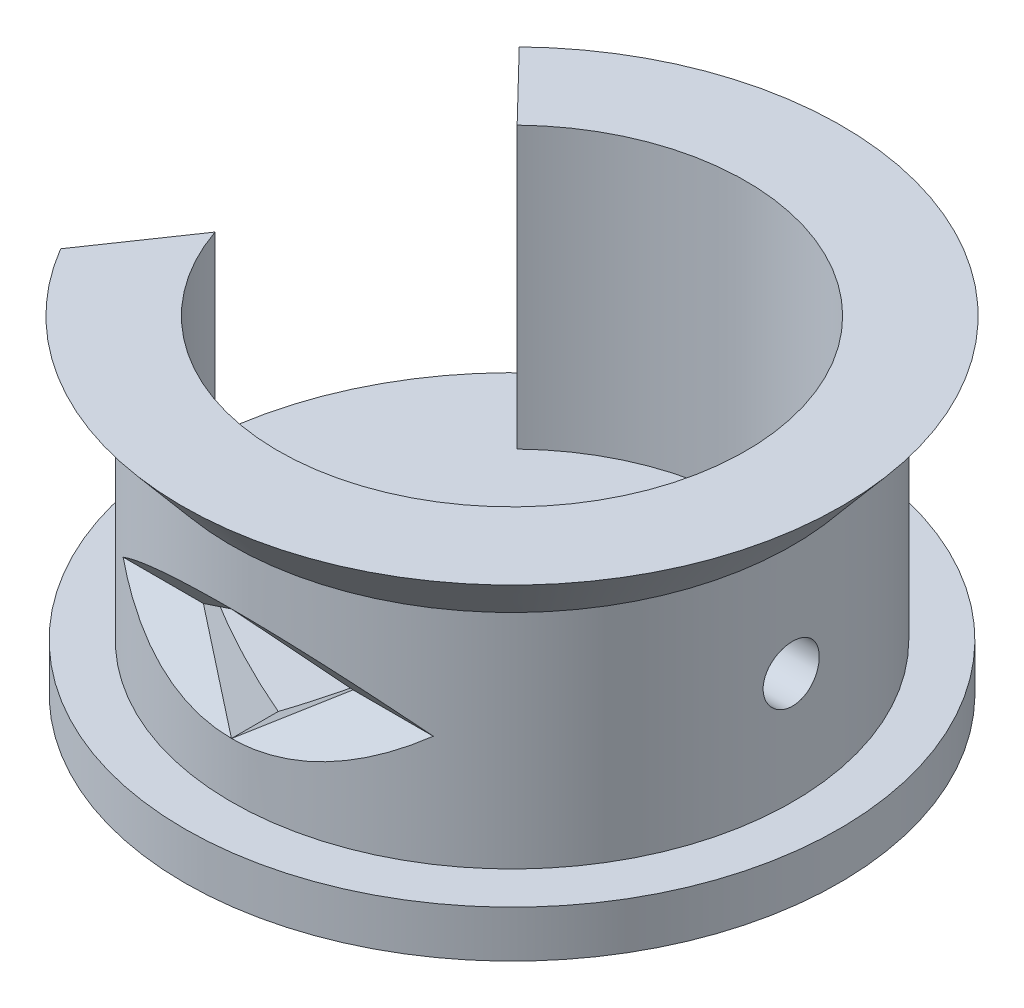
ISO-10303-21;
HEADER;
FILE_DESCRIPTION(('STEP AP214'),'2;1');
FILE_NAME('part.step','',(''),(''),'','','');
FILE_SCHEMA(('AUTOMOTIVE_DESIGN { 1 0 10303 214 1 1 1 1 }'));
ENDSEC;
DATA;
#1=APPLICATION_CONTEXT('core data for automotive mechanical design processes');
#2=APPLICATION_PROTOCOL_DEFINITION('international standard','automotive_design',2000,#1);
#3=PRODUCT_CONTEXT('',#1,'mechanical');
#4=PRODUCT('Part','Part','',(#3));
#5=PRODUCT_RELATED_PRODUCT_CATEGORY('part','',(#4));
#6=PRODUCT_DEFINITION_FORMATION('','',#4);
#7=PRODUCT_DEFINITION_CONTEXT('part definition',#1,'design');
#8=PRODUCT_DEFINITION('design','',#6,#7);
#9=PRODUCT_DEFINITION_SHAPE('','',#8);
#10=(LENGTH_UNIT() NAMED_UNIT(*) SI_UNIT(.MILLI.,.METRE.));
#11=(NAMED_UNIT(*) PLANE_ANGLE_UNIT() SI_UNIT($,.RADIAN.));
#12=(NAMED_UNIT(*) SI_UNIT($,.STERADIAN.) SOLID_ANGLE_UNIT());
#13=UNCERTAINTY_MEASURE_WITH_UNIT(LENGTH_MEASURE(1.E-05),#10,'distance_accuracy_value','');
#14=(GEOMETRIC_REPRESENTATION_CONTEXT(3) GLOBAL_UNCERTAINTY_ASSIGNED_CONTEXT((#13)) GLOBAL_UNIT_ASSIGNED_CONTEXT((#10,
#11,#12)) REPRESENTATION_CONTEXT('',''));
#15=CARTESIAN_POINT('',(0.,0.,0.));
#16=DIRECTION('',(0.,0.,1.));
#17=DIRECTION('',(1.,0.,0.));
#18=AXIS2_PLACEMENT_3D('',#15,#16,#17);
#19=CARTESIAN_POINT('',(0.,5.75,0.));
#20=DIRECTION('',(0.,-1.,0.));
#21=DIRECTION('',(0.,0.,-1.));
#22=AXIS2_PLACEMENT_3D('',#19,#20,#21);
#23=CYLINDRICAL_SURFACE('',#22,6.);
#24=CARTESIAN_POINT('',(0.,9.37500000000016,0.));
#25=DIRECTION('',(0.,-0.64018439966447,-0.768221279597384));
#26=DIRECTION('',(0.,-0.768221279597384,0.64018439966447));
#27=AXIS2_PLACEMENT_3D('',#24,#25,#26);
#28=ELLIPSE('',#27,9.37229961108813,6.);
#29=CARTESIAN_POINT('',(3.3166247903554,3.375,5.));
#30=VERTEX_POINT('',#29);
#31=CARTESIAN_POINT('',(0.,2.17499999999997,6.));
#32=VERTEX_POINT('',#31);
#33=EDGE_CURVE('E162',#30,#32,#28,.T.);
#34=ORIENTED_EDGE('',*,*,#33,.T.);
#35=CARTESIAN_POINT('',(-3.3166247903554,3.375,5.));
#36=VERTEX_POINT('',#35);
#37=EDGE_CURVE('E61',#32,#36,#28,.T.);
#38=ORIENTED_EDGE('',*,*,#37,.T.);
#39=CARTESIAN_POINT('',(0.,-2.625,0.));
#40=DIRECTION('',(0.,0.64018439966448,-0.768221279597376));
#41=DIRECTION('',(0.,-0.768221279597376,-0.64018439966448));
#42=AXIS2_PLACEMENT_3D('',#39,#40,#41);
#43=ELLIPSE('',#42,9.37229961108799,6.);
#44=CARTESIAN_POINT('',(0.,4.575,6.));
#45=VERTEX_POINT('',#44);
#46=EDGE_CURVE('E131',#36,#45,#43,.T.);
#47=ORIENTED_EDGE('',*,*,#46,.T.);
#48=EDGE_CURVE('E122',#45,#30,#43,.T.);
#49=ORIENTED_EDGE('',*,*,#48,.T.);
#50=EDGE_LOOP('',(#34,#38,#47,#49));
#51=FACE_BOUND('',#50,.T.);
#52=DIRECTION('',(0.,-1.,0.));
#53=VECTOR('',#52,1.);
#54=CARTESIAN_POINT('',(-5.40419060518485,5.75,2.60666912032038));
#55=LINE('',#54,#53);
#56=CARTESIAN_POINT('',(-5.40419060518485,1.,2.60666912032038));
#57=VERTEX_POINT('',#56);
#58=CARTESIAN_POINT('',(-5.40419060518485,5.75,2.60666912032038));
#59=VERTEX_POINT('',#58);
#60=EDGE_CURVE('E420',#57,#59,#55,.F.);
#61=ORIENTED_EDGE('',*,*,#60,.F.);
#62=CARTESIAN_POINT('',(0.,1.,0.));
#63=DIRECTION('',(0.,1.,0.));
#64=DIRECTION('',(0.,0.,1.));
#65=AXIS2_PLACEMENT_3D('',#62,#63,#64);
#66=CIRCLE('',#65,6.);
#67=CARTESIAN_POINT('',(-4.17641886951736,1.,-4.30784463813858));
#68=VERTEX_POINT('',#67);
#69=EDGE_CURVE('E387',#57,#68,#66,.T.);
#70=ORIENTED_EDGE('',*,*,#69,.T.);
#71=DIRECTION('',(0.,-1.,0.));
#72=VECTOR('',#71,1.);
#73=CARTESIAN_POINT('',(-4.17641886951736,5.75,-4.30784463813858));
#74=LINE('',#73,#72);
#75=CARTESIAN_POINT('',(-4.17641886951736,5.75,-4.30784463813858));
#76=VERTEX_POINT('',#75);
#77=EDGE_CURVE('E461',#68,#76,#74,.F.);
#78=ORIENTED_EDGE('',*,*,#77,.T.);
#79=CARTESIAN_POINT('',(0.,5.75,0.));
#80=DIRECTION('',(0.,1.,0.));
#81=DIRECTION('',(0.,0.,1.));
#82=AXIS2_PLACEMENT_3D('',#79,#80,#81);
#83=CIRCLE('',#82,6.);
#84=EDGE_CURVE('E400',#59,#76,#83,.T.);
#85=ORIENTED_EDGE('',*,*,#84,.F.);
#86=EDGE_LOOP('',(#61,#70,#78,#85));
#87=FACE_BOUND('',#86,.T.);
#88=CARTESIAN_POINT('',(5.96992462263972,3.375,0.6));
#89=CARTESIAN_POINT('',(5.96992501678142,3.34138826149584,0.599998544036107));
#90=CARTESIAN_POINT('',(5.97021154196531,3.3077542989529,0.597166115389485));
#91=CARTESIAN_POINT('',(5.97132652534872,3.24141888822388,0.585909788858137));
#92=CARTESIAN_POINT('',(5.97215558076732,3.20871850917751,0.577479728931861));
#93=CARTESIAN_POINT('',(5.97426079828433,3.14522050846926,0.555276069641356));
#94=CARTESIAN_POINT('',(5.97553668928074,3.11442174636514,0.541505709776339));
#95=CARTESIAN_POINT('',(5.97839148343092,3.05557932462495,0.50901856043466));
#96=CARTESIAN_POINT('',(5.97997032638597,3.02753511930977,0.490302753375555));
#97=CARTESIAN_POINT('',(5.98325956025939,2.9748892418055,0.448382857199222));
#98=CARTESIAN_POINT('',(5.9849703600316,2.95029899429773,0.425164450864955));
#99=CARTESIAN_POINT('',(5.98832703141431,2.90535743459786,0.374929029191738));
#100=CARTESIAN_POINT('',(5.98997290005128,2.88500631635621,0.347911840143941));
#101=CARTESIAN_POINT('',(5.99301829893363,2.84908124579571,0.290775816990592));
#102=CARTESIAN_POINT('',(5.99441730536788,2.8335174007238,0.260650597517741));
#103=CARTESIAN_POINT('',(5.99680690125462,2.80767334011079,0.198197990572506));
#104=CARTESIAN_POINT('',(5.99779750066238,2.79739299577832,0.165870656800931));
#105=CARTESIAN_POINT('',(5.99925579942616,2.78244125438805,0.100046869645769));
#106=CARTESIAN_POINT('',(5.9997252470569,2.77775110035003,0.0665547162189482));
#107=CARTESIAN_POINT('',(6.00009429359215,2.77405483851977,-0.000744444413366362));
#108=CARTESIAN_POINT('',(5.99999390727164,2.77504858335224,-0.0345514434326772));
#109=CARTESIAN_POINT('',(5.99923602786711,2.78267668359009,-0.101393306438736));
#110=CARTESIAN_POINT('',(5.99858052691028,2.78929086933833,-0.134430497960988));
#111=CARTESIAN_POINT('',(5.99678837558958,2.80794067736797,-0.19892350770272));
#112=CARTESIAN_POINT('',(5.99565171897572,2.81997637007254,-0.230379305374637));
#113=CARTESIAN_POINT('',(5.99302162490349,2.84914965795266,-0.290880188807752));
#114=CARTESIAN_POINT('',(5.99152756419455,2.86629617851809,-0.31992094258899));
#115=CARTESIAN_POINT('',(5.98835030711644,2.90519791400182,-0.374720107904516));
#116=CARTESIAN_POINT('',(5.98666710520087,2.92695326408711,-0.400478423136497));
#117=CARTESIAN_POINT('',(5.98329176080711,2.97456853770819,-0.448099663093614));
#118=CARTESIAN_POINT('',(5.98159961143817,3.00044600684495,-0.469945047714207));
#119=CARTESIAN_POINT('',(5.97840443956933,3.05551011912647,-0.508984521214751));
#120=CARTESIAN_POINT('',(5.97690141734379,3.08469676707129,-0.526178603347734));
#121=CARTESIAN_POINT('',(5.9742545370849,3.14556421511988,-0.555427310743938));
#122=CARTESIAN_POINT('',(5.97311075479533,3.17724553945373,-0.567480852343776));
#123=CARTESIAN_POINT('',(5.97131341122563,3.24219636276881,-0.586092441382554));
#124=CARTESIAN_POINT('',(5.97065983501061,3.27546581333247,-0.59265065624582));
#125=CARTESIAN_POINT('',(5.9699194831645,3.34249450771771,-0.600062865235176));
#126=CARTESIAN_POINT('',(5.96983026928562,3.3762510121589,-0.600941397988327));
#127=CARTESIAN_POINT('',(5.97022230812863,3.44343075949372,-0.597033748122817));
#128=CARTESIAN_POINT('',(5.97070355314237,3.47685400688422,-0.592247642045852));
#129=CARTESIAN_POINT('',(5.97218006653441,3.54234694936701,-0.577167104704512));
#130=CARTESIAN_POINT('',(5.97317425200807,3.5744193426568,-0.566884276313345));
#131=CARTESIAN_POINT('',(5.97556374623277,3.63638403103818,-0.541114031805564));
#132=CARTESIAN_POINT('',(5.97695906417202,3.66627627617231,-0.525626496470153));
#133=CARTESIAN_POINT('',(5.97999950613428,3.72314398441727,-0.48982500085393));
#134=CARTESIAN_POINT('',(5.98164546488803,3.75010916517975,-0.469494779904414));
#135=CARTESIAN_POINT('',(5.98499899575112,3.80025303196444,-0.424608320070704));
#136=CARTESIAN_POINT('',(5.9867065693852,3.82343162420405,-0.400051976548881));
#137=CARTESIAN_POINT('',(5.98999828709581,3.86542898003886,-0.347303882535884));
#138=CARTESIAN_POINT('',(5.99158196433285,3.88423173575173,-0.319099353581671));
#139=CARTESIAN_POINT('',(5.99444065263978,3.91683352110385,-0.259918630450278));
#140=CARTESIAN_POINT('',(5.99571566793895,3.93063261930426,-0.228942474257775));
#141=CARTESIAN_POINT('',(5.99781126248403,3.9528082605932,-0.165153675859689));
#142=CARTESIAN_POINT('',(5.99863265163389,3.96119447239513,-0.132344422589975));
#143=CARTESIAN_POINT('',(5.99973176768189,3.97233784174791,-0.0657748883902072));
#144=CARTESIAN_POINT('',(6.00000950985938,3.97509515750042,-0.0320146342153302));
#145=CARTESIAN_POINT('',(5.99999002987962,3.97490024013603,0.0353413344454483));
#146=CARTESIAN_POINT('',(5.99969531026002,3.97197285789801,0.0689371243347171));
#147=CARTESIAN_POINT('',(5.99856896146555,3.96054375260581,0.135157133013818));
#148=CARTESIAN_POINT('',(5.99773733186924,3.95204202517622,0.16778135104102));
#149=CARTESIAN_POINT('',(5.99563034288377,3.92971244556424,0.231131945260646));
#150=CARTESIAN_POINT('',(5.99435504401949,3.9158853198395,0.261858579646517));
#151=CARTESIAN_POINT('',(5.99150287449778,3.88330009864981,0.320558760092878));
#152=CARTESIAN_POINT('',(5.98992600560493,3.86454203203733,0.348532322261136));
#153=CARTESIAN_POINT('',(5.98663910801433,3.82253422858575,0.401059634656163));
#154=CARTESIAN_POINT('',(5.9849285487642,3.79926599025312,0.425598555731604));
#155=CARTESIAN_POINT('',(5.98157154461795,3.74893478907273,0.470434655635885));
#156=CARTESIAN_POINT('',(5.97992511520666,3.72187091689855,0.490730815108709));
#157=CARTESIAN_POINT('',(5.97687830046361,3.66464139484805,0.526545984254432));
#158=CARTESIAN_POINT('',(5.97547855155184,3.63446803120557,0.542052712796901));
#159=CARTESIAN_POINT('',(5.97309116857477,3.57195102525226,0.567758824859261));
#160=CARTESIAN_POINT('',(5.97210306992016,3.53960987764457,0.577964194733915));
#161=CARTESIAN_POINT('',(5.97090004522887,3.48507135546053,0.590233013000118));
#162=CARTESIAN_POINT('',(5.97053599161417,3.46322264921614,0.593890627438935));
#163=CARTESIAN_POINT('',(5.97004815106598,3.41925250617447,0.598774595163068));
#164=CARTESIAN_POINT('',(5.96992436312391,3.39713107052244,0.600000958654358));
#165=CARTESIAN_POINT('',(5.96992462263972,3.375,0.6));
#166=B_SPLINE_CURVE_WITH_KNOTS('',3,(#88,#89,#90,#91,#92,#93,#94,#95,#96,#97,#98,#99,#100,#101,
#102,#103,#104,#105,#106,#107,#108,#109,#110,#111,#112,#113,#114,#115,#116,#117,#118,#119,#120,
#121,#122,#123,#124,#125,#126,#127,#128,#129,#130,#131,#132,#133,#134,#135,#136,#137,#138,#139,
#140,#141,#142,#143,#144,#145,#146,#147,#148,#149,#150,#151,#152,#153,#154,#155,#156,#157,#158,
#159,#160,#161,#162,#163,#164,#165),.UNSPECIFIED.,.T.,.F.,(4,2,2,2,2,2,2,2,2,2,2,2,2,2,2,2,2,2,
2,2,2,2,2,2,2,2,2,2,2,2,2,2,2,2,2,2,2,2,4),(0.,0.100754396661877,0.201619891093062,
0.302424294598484,0.403208688252789,0.504318969179551,0.605433875131518,0.70676081982775,
0.808085294446769,0.909068825390698,1.01004973798939,1.11066979091197,1.21129115088585,
1.31208927279848,1.41289035131117,1.51413255051001,1.61537489656538,1.7166385747076,
1.8178991675702,1.91872197784659,2.01954342580122,2.12015288822716,2.22076465536628,
2.32171913887031,2.42267612233922,2.52399682090871,2.62531613110803,2.72645395616617,
2.82758893867889,2.9282828008109,3.02897674197995,3.12965695197148,3.23033657286479,
3.33143829022793,3.43256427020715,3.53394744642286,3.635215889364,3.70155616563628,
3.76789616342289),.UNSPECIFIED.);
#167=CARTESIAN_POINT('',(5.96992462263972,3.375,0.6));
#168=VERTEX_POINT('',#167);
#169=EDGE_CURVE('E168',#168,#168,#166,.T.);
#170=ORIENTED_EDGE('',*,*,#169,.F.);
#171=EDGE_LOOP('',(#170));
#172=FACE_BOUND('',#171,.T.);
#173=ADVANCED_FACE('F45',(#51,#87,#172),#23,.T.);
#174=CARTESIAN_POINT('',(0.,5.75,0.));
#175=DIRECTION('',(0.,-1.,0.));
#176=DIRECTION('',(0.,0.,-1.));
#177=AXIS2_PLACEMENT_3D('',#174,#175,#176);
#178=CYLINDRICAL_SURFACE('',#177,5.);
#179=CARTESIAN_POINT('',(0.,1.,0.));
#180=DIRECTION('',(0.,1.,0.));
#181=DIRECTION('',(0.,0.,1.));
#182=AXIS2_PLACEMENT_3D('',#179,#180,#181);
#183=CIRCLE('',#182,5.);
#184=CARTESIAN_POINT('',(-3.48034905793113,1.,-3.58987053178215));
#185=VERTEX_POINT('',#184);
#186=CARTESIAN_POINT('',(-4.73004533541473,1.,1.62070081289587));
#187=VERTEX_POINT('',#186);
#188=EDGE_CURVE('E391',#185,#187,#183,.F.);
#189=ORIENTED_EDGE('',*,*,#188,.T.);
#190=DIRECTION('',(0.,1.,0.));
#191=VECTOR('',#190,1.);
#192=CARTESIAN_POINT('',(-4.73004533541473,1.,1.62070081289587));
#193=LINE('',#192,#191);
#194=CARTESIAN_POINT('',(-4.73004533541473,7.,1.62070081289587));
#195=VERTEX_POINT('',#194);
#196=EDGE_CURVE('E458',#187,#195,#193,.T.);
#197=ORIENTED_EDGE('',*,*,#196,.T.);
#198=CARTESIAN_POINT('',(0.,7.,0.));
#199=DIRECTION('',(0.,1.,0.));
#200=DIRECTION('',(0.,0.,1.));
#201=AXIS2_PLACEMENT_3D('',#198,#199,#200);
#202=CIRCLE('',#201,5.);
#203=CARTESIAN_POINT('',(-3.48034905793113,7.,-3.58987053178215));
#204=VERTEX_POINT('',#203);
#205=EDGE_CURVE('E394',#195,#204,#202,.T.);
#206=ORIENTED_EDGE('',*,*,#205,.T.);
#207=DIRECTION('',(0.,1.,0.));
#208=VECTOR('',#207,1.);
#209=CARTESIAN_POINT('',(-3.48034905793113,1.,-3.58987053178215));
#210=LINE('',#209,#208);
#211=EDGE_CURVE('E456',#185,#204,#210,.T.);
#212=ORIENTED_EDGE('',*,*,#211,.F.);
#213=EDGE_LOOP('',(#189,#197,#206,#212));
#214=FACE_BOUND('',#213,.T.);
#215=CARTESIAN_POINT('',(0.,4.575,0.));
#216=DIRECTION('',(-0.6,0.8,0.));
#217=DIRECTION('',(-0.8,-0.6,0.));
#218=AXIS2_PLACEMENT_3D('',#215,#216,#217);
#219=ELLIPSE('',#218,6.25,5.);
#220=CARTESIAN_POINT('',(-1.6,3.375,4.73708771293081));
#221=VERTEX_POINT('',#220);
#222=CARTESIAN_POINT('',(0.,4.575,5.));
#223=VERTEX_POINT('',#222);
#224=EDGE_CURVE('E154',#221,#223,#219,.T.);
#225=ORIENTED_EDGE('',*,*,#224,.F.);
#226=CARTESIAN_POINT('',(0.,2.175,0.));
#227=DIRECTION('',(0.6,0.8,0.));
#228=DIRECTION('',(0.8,-0.6,0.));
#229=AXIS2_PLACEMENT_3D('',#226,#227,#228);
#230=ELLIPSE('',#229,6.25,5.);
#231=CARTESIAN_POINT('',(0.,2.175,5.));
#232=VERTEX_POINT('',#231);
#233=EDGE_CURVE('E449',#221,#232,#230,.T.);
#234=ORIENTED_EDGE('',*,*,#233,.T.);
#235=CARTESIAN_POINT('',(0.,2.175,0.));
#236=DIRECTION('',(-0.6,0.8,0.));
#237=DIRECTION('',(-0.8,-0.6,0.));
#238=AXIS2_PLACEMENT_3D('',#235,#236,#237);
#239=ELLIPSE('',#238,6.25,5.);
#240=CARTESIAN_POINT('',(1.6,3.375,4.73708771293081));
#241=VERTEX_POINT('',#240);
#242=EDGE_CURVE('E445',#232,#241,#239,.T.);
#243=ORIENTED_EDGE('',*,*,#242,.T.);
#244=CARTESIAN_POINT('',(0.,4.575,0.));
#245=DIRECTION('',(0.6,0.8,0.));
#246=DIRECTION('',(0.8,-0.6,0.));
#247=AXIS2_PLACEMENT_3D('',#244,#245,#246);
#248=ELLIPSE('',#247,6.25,5.);
#249=EDGE_CURVE('E442',#223,#241,#248,.T.);
#250=ORIENTED_EDGE('',*,*,#249,.F.);
#251=EDGE_LOOP('',(#225,#234,#243,#250));
#252=FACE_BOUND('',#251,.T.);
#253=CARTESIAN_POINT('',(4.96386945839634,3.375,0.6));
#254=CARTESIAN_POINT('',(4.9638699235667,3.34142817176193,0.599998566345552));
#255=CARTESIAN_POINT('',(4.96421371576855,3.30783509597572,0.597172826992676));
#256=CARTESIAN_POINT('',(4.96555129020866,3.24158307759369,0.585944637419275));
#257=CARTESIAN_POINT('',(4.96654575971934,3.20892516086379,0.577536290478033));
#258=CARTESIAN_POINT('',(4.96907046210478,3.14551231889724,0.555393669231672));
#259=CARTESIAN_POINT('',(4.9706003397472,3.11475614777276,0.541662925579496));
#260=CARTESIAN_POINT('',(4.97402304999376,3.05599057157981,0.509272675115884));
#261=CARTESIAN_POINT('',(4.97591581835864,3.02798068168641,0.490614040424029));
#262=CARTESIAN_POINT('',(4.97986200109296,2.97535204567797,0.448794287860078));
#263=CARTESIAN_POINT('',(4.98191611633016,2.95074954113028,0.425612794501293));
#264=CARTESIAN_POINT('',(4.98594723170915,2.90577425636762,0.375449172869758));
#265=CARTESIAN_POINT('',(4.98792422807936,2.88540168281164,0.348466859010827));
#266=CARTESIAN_POINT('',(4.99158548046123,2.84940669341274,0.291365913693595));
#267=CARTESIAN_POINT('',(4.99326882761331,2.83379891685207,0.261237990769797));
#268=CARTESIAN_POINT('',(4.99614542486483,2.80787030792305,0.198765153454555));
#269=CARTESIAN_POINT('',(4.99733869178934,2.79754929405045,0.166420315217108));
#270=CARTESIAN_POINT('',(4.99909574649051,2.78253554877931,0.100597571397016));
#271=CARTESIAN_POINT('',(4.99966254728816,2.77781586931085,0.0671258942086757));
#272=CARTESIAN_POINT('',(5.00011308732203,2.7740552801379,-0.000138899333713211));
#273=CARTESIAN_POINT('',(4.99999685144069,2.77501416356836,-0.0339320039336681));
#274=CARTESIAN_POINT('',(4.99909685850532,2.78256182437027,-0.100697133503506));
#275=CARTESIAN_POINT('',(4.99831653768676,2.78912162099448,-0.133672487513643));
#276=CARTESIAN_POINT('',(4.99617992844761,2.8076396303432,-0.198050874018236));
#277=CARTESIAN_POINT('',(4.99482362980932,2.81959793883633,-0.229453878608521));
#278=CARTESIAN_POINT('',(4.99168155809107,2.8486045457813,-0.289886224651875));
#279=CARTESIAN_POINT('',(4.98989472377384,2.86566544720128,-0.318909459455077));
#280=CARTESIAN_POINT('',(4.98609161934322,2.90438377979123,-0.373691784039757));
#281=CARTESIAN_POINT('',(4.98407533953192,2.92604140528312,-0.399450735753378));
#282=CARTESIAN_POINT('',(4.98002413490592,2.97350086990809,-0.447143442246099));
#283=CARTESIAN_POINT('',(4.97798917265084,2.9993279562747,-0.469052077756758));
#284=CARTESIAN_POINT('',(4.97414252092149,3.0543063027359,-0.508227183650314));
#285=CARTESIAN_POINT('',(4.9723308320519,3.0834575718329,-0.525493641461051));
#286=CARTESIAN_POINT('',(4.96913584110431,3.14427849802948,-0.554895356717299));
#287=CARTESIAN_POINT('',(4.96775269869133,3.17594908825158,-0.567028702315283));
#288=CARTESIAN_POINT('',(4.96557456613223,3.24089847190024,-0.585798020064755));
#289=CARTESIAN_POINT('',(4.96477954993463,3.27417719402386,-0.592434235717102));
#290=CARTESIAN_POINT('',(4.96387240031274,3.34117661927534,-0.59998785742433));
#291=CARTESIAN_POINT('',(4.96375605121268,3.37489328717623,-0.600940568541544));
#292=CARTESIAN_POINT('',(4.96420826602292,3.44200575616859,-0.597193196111205));
#293=CARTESIAN_POINT('',(4.96477681650601,3.47540156353748,-0.592493223382497));
#294=CARTESIAN_POINT('',(4.96653092549957,3.5408191567196,-0.577603583884036));
#295=CARTESIAN_POINT('',(4.96771457204317,3.57284486936186,-0.567430924997875));
#296=CARTESIAN_POINT('',(4.97056395706497,3.63473585659519,-0.541902153585248));
#297=CARTESIAN_POINT('',(4.97222971121828,3.66460106090061,-0.526545872517223));
#298=CARTESIAN_POINT('',(4.97586574626598,3.72148325899492,-0.490998605443221));
#299=CARTESIAN_POINT('',(4.97783747219711,3.74848565737626,-0.470784414282952));
#300=CARTESIAN_POINT('',(4.98185871080738,3.79872702260236,-0.426128035673414));
#301=CARTESIAN_POINT('',(4.98390822626876,3.82196585468118,-0.40168569688724));
#302=CARTESIAN_POINT('',(4.98786701889821,3.86414394944698,-0.349112854533544));
#303=CARTESIAN_POINT('',(4.98977550512061,3.88306004930228,-0.320963699883566));
#304=CARTESIAN_POINT('',(4.9932254486232,3.91589564186582,-0.261867285882116));
#305=CARTESIAN_POINT('',(4.99476691280075,3.92981522847489,-0.230920079128883));
#306=CARTESIAN_POINT('',(4.99730560861028,3.95222420097516,-0.167183848943998));
#307=CARTESIAN_POINT('',(4.99830419405257,3.96072710397685,-0.134399634129437));
#308=CARTESIAN_POINT('',(4.99965022729014,3.97210534871643,-0.0678561169982956));
#309=CARTESIAN_POINT('',(4.99999770203132,3.97498092333863,-0.0340968550922521));
#310=CARTESIAN_POINT('',(5.00000226097294,3.97501876882246,0.033212001251132));
#311=CARTESIAN_POINT('',(4.99966366730498,3.97221680733664,0.0667615809317745));
#312=CARTESIAN_POINT('',(4.99834270804142,3.9610547090195,0.132909444959247));
#313=CARTESIAN_POINT('',(4.99736034265685,3.9526945740101,0.165507729617898));
#314=CARTESIAN_POINT('',(4.99486176038979,3.93066439697368,0.228823911196723));
#315=CARTESIAN_POINT('',(4.99334570158299,3.9169959271091,0.259542361749599));
#316=CARTESIAN_POINT('',(4.98994784886322,3.88474078608312,0.318255082105062));
#317=CARTESIAN_POINT('',(4.98806605199043,3.86615407511943,0.34624932985874));
#318=CARTESIAN_POINT('',(4.98413278724527,3.82445726359875,0.398901896849716));
#319=CARTESIAN_POINT('',(4.98208036352183,3.80132052893485,0.423539053575359));
#320=CARTESIAN_POINT('',(4.97804493729182,3.75123539256951,0.468595461424817));
#321=CARTESIAN_POINT('',(4.97606195138489,3.72428608709974,0.489013709626173));
#322=CARTESIAN_POINT('',(4.97238238415055,3.6672314127659,0.525114149457491));
#323=CARTESIAN_POINT('',(4.97068684912818,3.63711513434541,0.540779196400619));
#324=CARTESIAN_POINT('',(4.96778644753479,3.57467644924984,0.566807611647488));
#325=CARTESIAN_POINT('',(4.96658104327924,3.54235650576045,0.57717679285206));
#326=CARTESIAN_POINT('',(4.96509254473976,3.48738809217892,0.589814020147281));
#327=CARTESIAN_POINT('',(4.96463614619901,3.46508744960802,0.593628329883895));
#328=CARTESIAN_POINT('',(4.9640244474611,3.42019441357315,0.598721793819022));
#329=CARTESIAN_POINT('',(4.96386914522333,3.39760202208748,0.600000965198835));
#330=CARTESIAN_POINT('',(4.96386945839634,3.375,0.6));
#331=B_SPLINE_CURVE_WITH_KNOTS('',3,(#253,#254,#255,#256,#257,#258,#259,#260,#261,#262,#263,
#264,#265,#266,#267,#268,#269,#270,#271,#272,#273,#274,#275,#276,#277,#278,#279,#280,#281,#282,
#283,#284,#285,#286,#287,#288,#289,#290,#291,#292,#293,#294,#295,#296,#297,#298,#299,#300,#301,
#302,#303,#304,#305,#306,#307,#308,#309,#310,#311,#312,#313,#314,#315,#316,#317,#318,#319,#320,
#321,#322,#323,#324,#325,#326,#327,#328,#329,#330),.UNSPECIFIED.,.T.,.F.,(4,2,2,2,2,2,2,2,2,2,2,
2,2,2,2,2,2,2,2,2,2,2,2,2,2,2,2,2,2,2,2,2,2,2,2,2,2,2,4),(0.,0.100632922643844,
0.201372309927725,0.302044985008905,0.402699855344441,0.503819106641508,0.604943297094443,
0.706375123507079,0.807803467345789,0.908741834432208,1.00967652444525,1.11009209231738,
1.21050944161334,1.31117689071054,1.41184859627167,1.51315448881769,1.61446065572223,
1.71580452135318,1.81714389761633,1.91785310817259,2.018560344393,2.11895639793242,
2.21935571608811,2.32024450062123,2.42113689698587,2.52255785859056,2.62397691406367,
2.72514188068195,2.82630266054771,2.9268281237563,3.02735355401375,3.12784923446599,
3.2283457282335,3.32944900824762,3.43057629503645,3.53206412432329,3.63344031682385,
3.70119125785949,3.76894173972763),.UNSPECIFIED.);
#332=CARTESIAN_POINT('',(4.96386945839634,3.375,0.6));
#333=VERTEX_POINT('',#332);
#334=EDGE_CURVE('E178',#333,#333,#331,.T.);
#335=ORIENTED_EDGE('',*,*,#334,.T.);
#336=EDGE_LOOP('',(#335));
#337=FACE_BOUND('',#336,.T.);
#338=ADVANCED_FACE('F210',(#214,#252,#337),#178,.F.);
#339=CARTESIAN_POINT('',(0.,7.,0.));
#340=DIRECTION('',(0.,1.,0.));
#341=DIRECTION('',(0.,0.,1.));
#342=AXIS2_PLACEMENT_3D('',#339,#340,#341);
#343=PLANE('',#342);
#344=ORIENTED_EDGE('',*,*,#205,.F.);
#345=DIRECTION('',(-0.564418925597191,0.,0.825488507750237));
#346=VECTOR('',#345,1.);
#347=CARTESIAN_POINT('',(-2.46808174143914,7.,-1.68752445577426));
#348=LINE('',#347,#346);
#349=CARTESIAN_POINT('',(-6.07097894102737,7.,3.58187757520611));
#350=VERTEX_POINT('',#349);
#351=EDGE_CURVE('E417',#195,#350,#348,.T.);
#352=ORIENTED_EDGE('',*,*,#351,.T.);
#353=CARTESIAN_POINT('',(0.,7.,0.));
#354=DIRECTION('',(0.,-1.,0.));
#355=DIRECTION('',(0.,0.,-1.));
#356=AXIS2_PLACEMENT_3D('',#353,#354,#355);
#357=CIRCLE('',#356,7.04887453897161);
#358=CARTESIAN_POINT('',(-4.90650877223692,7.,-5.06090939793674));
#359=VERTEX_POINT('',#358);
#360=EDGE_CURVE('E408',#359,#350,#357,.T.);
#361=ORIENTED_EDGE('',*,*,#360,.F.);
#362=DIRECTION('',(-0.696069811586227,0.,-0.71797410635643));
#363=VECTOR('',#362,1.);
#364=CARTESIAN_POINT('',(0.,7.,0.));
#365=LINE('',#364,#363);
#366=EDGE_CURVE('E177',#204,#359,#365,.T.);
#367=ORIENTED_EDGE('',*,*,#366,.F.);
#368=EDGE_LOOP('',(#344,#352,#361,#367));
#369=FACE_BOUND('',#368,.T.);
#370=ADVANCED_FACE('F214',(#369),#343,.T.);
#371=CARTESIAN_POINT('',(0.,7.,0.));
#372=DIRECTION('',(0.,1.,0.));
#373=DIRECTION('',(0.,0.,1.));
#374=AXIS2_PLACEMENT_3D('',#371,#372,#373);
#375=CONICAL_SURFACE('',#374,7.04887453897161,0.698131700797736);
#376=CARTESIAN_POINT('',(-5.40408135359552,5.74980000000018,2.60650933487139));
#377=CARTESIAN_POINT('',(-5.46035967521203,5.8528308374435,2.6888189556566));
#378=CARTESIAN_POINT('',(-5.51643368946077,5.95621083201673,2.77082976756688));
#379=CARTESIAN_POINT('',(-5.6282191357901,6.16357875625857,2.93432109837397));
#380=CARTESIAN_POINT('',(-5.68393057839927,6.26756666810615,3.0158016326693));
#381=CARTESIAN_POINT('',(-5.79503982085093,6.47606537278013,3.17830398436072));
#382=CARTESIAN_POINT('',(-5.8504376227844,6.58057616211187,3.25932580481493));
#383=CARTESIAN_POINT('',(-5.96095815278763,6.79005911062497,3.42096713760972));
#384=CARTESIAN_POINT('',(-6.01608087279734,6.89503128315761,3.50158663816209));
#385=CARTESIAN_POINT('',(-6.07108353663259,7.00019999999998,3.58203055106528));
#386=B_SPLINE_CURVE_WITH_KNOTS('',3,(#376,#377,#378,#379,#380,#381,#382,#383,#384,#385),
.UNSPECIFIED.,.F.,.F.,(4,2,2,2,4),(0.,0.430134286923613,0.860256027114606,1.29037489640516,
1.7205062952913),.UNSPECIFIED.);
#387=EDGE_CURVE('E141',#59,#350,#386,.T.);
#388=ORIENTED_EDGE('',*,*,#387,.F.);
#389=ORIENTED_EDGE('',*,*,#84,.T.);
#390=DIRECTION('',(-0.447425050364473,0.766044443118975,-0.461504859641681));
#391=VECTOR('',#390,1.);
#392=CARTESIAN_POINT('',(0.,-1.4005215555652,0.));
#393=LINE('',#392,#391);
#394=EDGE_CURVE('E404',#76,#359,#393,.T.);
#395=ORIENTED_EDGE('',*,*,#394,.T.);
#396=ORIENTED_EDGE('',*,*,#360,.T.);
#397=EDGE_LOOP('',(#388,#389,#395,#396));
#398=FACE_BOUND('',#397,.T.);
#399=ADVANCED_FACE('F218',(#398),#375,.T.);
#400=CARTESIAN_POINT('',(0.,1.,0.));
#401=DIRECTION('',(0.,-1.,0.));
#402=DIRECTION('',(0.,0.,-1.));
#403=AXIS2_PLACEMENT_3D('',#400,#401,#402);
#404=CYLINDRICAL_SURFACE('',#403,7.);
#405=CARTESIAN_POINT('',(0.,1.,0.));
#406=DIRECTION('',(0.,1.,0.));
#407=DIRECTION('',(0.,0.,1.));
#408=AXIS2_PLACEMENT_3D('',#405,#406,#407);
#409=CIRCLE('',#408,7.);
#410=CARTESIAN_POINT('',(0.,1.,7.));
#411=VERTEX_POINT('',#410);
#412=EDGE_CURVE('E381',#411,#411,#409,.T.);
#413=ORIENTED_EDGE('',*,*,#412,.F.);
#414=EDGE_LOOP('',(#413));
#415=FACE_BOUND('',#414,.T.);
#416=CARTESIAN_POINT('',(0.,0.,0.));
#417=DIRECTION('',(0.,1.,0.));
#418=DIRECTION('',(0.,0.,1.));
#419=AXIS2_PLACEMENT_3D('',#416,#417,#418);
#420=CIRCLE('',#419,7.);
#421=CARTESIAN_POINT('',(0.,0.,7.));
#422=VERTEX_POINT('',#421);
#423=EDGE_CURVE('E384',#422,#422,#420,.T.);
#424=ORIENTED_EDGE('',*,*,#423,.T.);
#425=EDGE_LOOP('',(#424));
#426=FACE_BOUND('',#425,.T.);
#427=ADVANCED_FACE('F47',(#415,#426),#404,.T.);
#428=CARTESIAN_POINT('',(0.,1.,0.));
#429=DIRECTION('',(0.,1.,0.));
#430=DIRECTION('',(0.,0.,1.));
#431=AXIS2_PLACEMENT_3D('',#428,#429,#430);
#432=PLANE('',#431);
#433=ORIENTED_EDGE('',*,*,#412,.T.);
#434=EDGE_LOOP('',(#433));
#435=FACE_BOUND('',#434,.T.);
#436=ORIENTED_EDGE('',*,*,#69,.F.);
#437=DIRECTION('',(-0.564418925597191,0.,0.825488507750237));
#438=VECTOR('',#437,1.);
#439=CARTESIAN_POINT('',(-2.46808174143914,1.,-1.68752445577426));
#440=LINE('',#439,#438);
#441=EDGE_CURVE('E467',#187,#57,#440,.T.);
#442=ORIENTED_EDGE('',*,*,#441,.F.);
#443=ORIENTED_EDGE('',*,*,#188,.F.);
#444=DIRECTION('',(-0.696069811586227,0.,-0.71797410635643));
#445=VECTOR('',#444,1.);
#446=CARTESIAN_POINT('',(0.,1.,0.));
#447=LINE('',#446,#445);
#448=EDGE_CURVE('E179',#185,#68,#447,.T.);
#449=ORIENTED_EDGE('',*,*,#448,.T.);
#450=EDGE_LOOP('',(#436,#442,#443,#449));
#451=FACE_BOUND('',#450,.T.);
#452=CARTESIAN_POINT('',(0.,1.,0.));
#453=DIRECTION('',(0.,1.,0.));
#454=DIRECTION('',(0.,0.,1.));
#455=AXIS2_PLACEMENT_3D('',#452,#453,#454);
#456=CIRCLE('',#455,2.4);
#457=CARTESIAN_POINT('',(0.,1.,2.4));
#458=VERTEX_POINT('',#457);
#459=EDGE_CURVE('E409',#458,#458,#456,.T.);
#460=ORIENTED_EDGE('',*,*,#459,.F.);
#461=EDGE_LOOP('',(#460));
#462=FACE_BOUND('',#461,.T.);
#463=ADVANCED_FACE('F357',(#435,#451,#462),#432,.T.);
#464=CARTESIAN_POINT('',(0.,0.,0.));
#465=DIRECTION('',(0.,1.,0.));
#466=DIRECTION('',(0.,0.,1.));
#467=AXIS2_PLACEMENT_3D('',#464,#465,#466);
#468=PLANE('',#467);
#469=CARTESIAN_POINT('',(0.,0.,0.));
#470=DIRECTION('',(0.,1.,0.));
#471=DIRECTION('',(0.,0.,1.));
#472=AXIS2_PLACEMENT_3D('',#469,#470,#471);
#473=CIRCLE('',#472,2.4);
#474=CARTESIAN_POINT('',(0.,0.,2.4));
#475=VERTEX_POINT('',#474);
#476=EDGE_CURVE('E405',#475,#475,#473,.T.);
#477=ORIENTED_EDGE('',*,*,#476,.T.);
#478=EDGE_LOOP('',(#477));
#479=FACE_BOUND('',#478,.T.);
#480=ORIENTED_EDGE('',*,*,#423,.F.);
#481=EDGE_LOOP('',(#480));
#482=FACE_BOUND('',#481,.T.);
#483=ADVANCED_FACE('F224',(#479,#482),#468,.F.);
#484=CARTESIAN_POINT('',(1.044,1.392,10.));
#485=DIRECTION('',(0.6,0.8,0.));
#486=DIRECTION('',(-0.8,0.6,0.));
#487=AXIS2_PLACEMENT_3D('',#484,#485,#486);
#488=PLANE('',#487);
#489=DIRECTION('',(-0.715541752799936,0.536656314599952,-0.447213595499949));
#490=VECTOR('',#489,1.);
#491=CARTESIAN_POINT('',(2.1152,0.588600000000002,7.32199999999994));
#492=LINE('',#491,#490);
#493=CARTESIAN_POINT('',(-1.6,3.375,5.));
#494=VERTEX_POINT('',#493);
#495=EDGE_CURVE('E160',#32,#494,#492,.T.);
#496=ORIENTED_EDGE('',*,*,#495,.F.);
#497=DIRECTION('',(0.,0.,-1.));
#498=VECTOR('',#497,1.);
#499=CARTESIAN_POINT('',(0.,2.175,10.));
#500=LINE('',#499,#498);
#501=EDGE_CURVE('E436',#32,#232,#500,.T.);
#502=ORIENTED_EDGE('',*,*,#501,.T.);
#503=ORIENTED_EDGE('',*,*,#233,.F.);
#504=DIRECTION('',(0.,0.,-1.));
#505=VECTOR('',#504,1.);
#506=CARTESIAN_POINT('',(-1.6,3.375,10.));
#507=LINE('',#506,#505);
#508=EDGE_CURVE('E156',#494,#221,#507,.T.);
#509=ORIENTED_EDGE('',*,*,#508,.F.);
#510=EDGE_LOOP('',(#496,#502,#503,#509));
#511=FACE_BOUND('',#510,.T.);
#512=ADVANCED_FACE('F220',(#511),#488,.T.);
#513=CARTESIAN_POINT('',(-1.044,1.392,10.));
#514=DIRECTION('',(-0.6,0.8,0.));
#515=DIRECTION('',(-0.8,-0.6,0.));
#516=AXIS2_PLACEMENT_3D('',#513,#514,#515);
#517=PLANE('',#516);
#518=DIRECTION('',(-0.715541752799936,-0.536656314599952,0.447213595499949));
#519=VECTOR('',#518,1.);
#520=CARTESIAN_POINT('',(-2.1152,0.588600000000002,7.32199999999994));
#521=LINE('',#520,#519);
#522=CARTESIAN_POINT('',(1.6,3.375,5.));
#523=VERTEX_POINT('',#522);
#524=EDGE_CURVE('E11',#523,#32,#521,.T.);
#525=ORIENTED_EDGE('',*,*,#524,.F.);
#526=DIRECTION('',(0.,0.,-1.));
#527=VECTOR('',#526,1.);
#528=CARTESIAN_POINT('',(1.6,3.375,10.));
#529=LINE('',#528,#527);
#530=EDGE_CURVE('E149',#523,#241,#529,.T.);
#531=ORIENTED_EDGE('',*,*,#530,.T.);
#532=ORIENTED_EDGE('',*,*,#242,.F.);
#533=ORIENTED_EDGE('',*,*,#501,.F.);
#534=EDGE_LOOP('',(#525,#531,#532,#533));
#535=FACE_BOUND('',#534,.T.);
#536=ADVANCED_FACE('F223',(#535),#517,.T.);
#537=CARTESIAN_POINT('',(2.196,2.928,10.));
#538=DIRECTION('',(0.6,0.8,0.));
#539=DIRECTION('',(-0.8,0.6,0.));
#540=AXIS2_PLACEMENT_3D('',#537,#538,#539);
#541=PLANE('',#540);
#542=ORIENTED_EDGE('',*,*,#530,.F.);
#543=DIRECTION('',(-0.715541752799933,0.53665631459995,0.447213595499958));
#544=VECTOR('',#543,1.);
#545=CARTESIAN_POINT('',(0.476800000000001,4.2174,5.702));
#546=LINE('',#545,#544);
#547=EDGE_CURVE('E126',#523,#45,#546,.T.);
#548=ORIENTED_EDGE('',*,*,#547,.T.);
#549=DIRECTION('',(0.,0.,-1.));
#550=VECTOR('',#549,1.);
#551=CARTESIAN_POINT('',(0.,4.575,10.));
#552=LINE('',#551,#550);
#553=EDGE_CURVE('E147',#45,#223,#552,.T.);
#554=ORIENTED_EDGE('',*,*,#553,.T.);
#555=ORIENTED_EDGE('',*,*,#249,.T.);
#556=EDGE_LOOP('',(#542,#548,#554,#555));
#557=FACE_BOUND('',#556,.T.);
#558=ADVANCED_FACE('F145',(#557),#541,.F.);
#559=CARTESIAN_POINT('',(-2.196,2.928,10.));
#560=DIRECTION('',(-0.6,0.8,0.));
#561=DIRECTION('',(-0.8,-0.6,0.));
#562=AXIS2_PLACEMENT_3D('',#559,#560,#561);
#563=PLANE('',#562);
#564=ORIENTED_EDGE('',*,*,#553,.F.);
#565=DIRECTION('',(-0.715541752799933,-0.53665631459995,-0.447213595499958));
#566=VECTOR('',#565,1.);
#567=CARTESIAN_POINT('',(-0.476800000000001,4.2174,5.702));
#568=LINE('',#567,#566);
#569=EDGE_CURVE('E54',#45,#494,#568,.T.);
#570=ORIENTED_EDGE('',*,*,#569,.T.);
#571=ORIENTED_EDGE('',*,*,#508,.T.);
#572=ORIENTED_EDGE('',*,*,#224,.T.);
#573=EDGE_LOOP('',(#564,#570,#571,#572));
#574=FACE_BOUND('',#573,.T.);
#575=ADVANCED_FACE('F152',(#574),#563,.F.);
#576=CARTESIAN_POINT('',(0.,-9.,0.));
#577=DIRECTION('',(0.,1.,0.));
#578=DIRECTION('',(0.,0.,1.));
#579=AXIS2_PLACEMENT_3D('',#576,#577,#578);
#580=CYLINDRICAL_SURFACE('',#579,2.4);
#581=ORIENTED_EDGE('',*,*,#459,.T.);
#582=EDGE_LOOP('',(#581));
#583=FACE_BOUND('',#582,.T.);
#584=ORIENTED_EDGE('',*,*,#476,.F.);
#585=EDGE_LOOP('',(#584));
#586=FACE_BOUND('',#585,.T.);
#587=ADVANCED_FACE('F232',(#583,#586),#580,.F.);
#588=CARTESIAN_POINT('',(-2.46808174143914,1.,-1.68752445577426));
#589=DIRECTION('',(-0.825488507750237,0.,-0.564418925597191));
#590=DIRECTION('',(-0.564418925597191,0.,0.825488507750237));
#591=AXIS2_PLACEMENT_3D('',#588,#589,#590);
#592=PLANE('',#591);
#593=ORIENTED_EDGE('',*,*,#60,.T.);
#594=ORIENTED_EDGE('',*,*,#387,.T.);
#595=ORIENTED_EDGE('',*,*,#351,.F.);
#596=ORIENTED_EDGE('',*,*,#196,.F.);
#597=ORIENTED_EDGE('',*,*,#441,.T.);
#598=EDGE_LOOP('',(#593,#594,#595,#596,#597));
#599=FACE_BOUND('',#598,.T.);
#600=ADVANCED_FACE('F193',(#599),#592,.T.);
#601=CARTESIAN_POINT('',(0.,1.,0.));
#602=DIRECTION('',(0.71797410635643,0.,-0.696069811586227));
#603=DIRECTION('',(-0.696069811586227,0.,-0.71797410635643));
#604=AXIS2_PLACEMENT_3D('',#601,#602,#603);
#605=PLANE('',#604);
#606=ORIENTED_EDGE('',*,*,#448,.F.);
#607=ORIENTED_EDGE('',*,*,#211,.T.);
#608=ORIENTED_EDGE('',*,*,#366,.T.);
#609=ORIENTED_EDGE('',*,*,#394,.F.);
#610=ORIENTED_EDGE('',*,*,#77,.F.);
#611=EDGE_LOOP('',(#606,#607,#608,#609,#610));
#612=FACE_BOUND('',#611,.T.);
#613=ADVANCED_FACE('F189',(#612),#605,.F.);
#614=CARTESIAN_POINT('',(10.,3.375,0.));
#615=DIRECTION('',(-1.,0.,0.));
#616=DIRECTION('',(0.,0.,1.));
#617=AXIS2_PLACEMENT_3D('',#614,#615,#616);
#618=CYLINDRICAL_SURFACE('',#617,0.6);
#619=ORIENTED_EDGE('',*,*,#334,.F.);
#620=EDGE_LOOP('',(#619));
#621=FACE_BOUND('',#620,.T.);
#622=ORIENTED_EDGE('',*,*,#169,.T.);
#623=EDGE_LOOP('',(#622));
#624=FACE_BOUND('',#623,.T.);
#625=ADVANCED_FACE('F184',(#621,#624),#618,.F.);
#626=CARTESIAN_POINT('',(10.,-1.07581967213115,1.29098360655738));
#627=DIRECTION('',(0.,0.64018439966448,-0.768221279597376));
#628=DIRECTION('',(0.,0.768221279597376,0.64018439966448));
#629=AXIS2_PLACEMENT_3D('',#626,#627,#628);
#630=PLANE('',#629);
#631=DIRECTION('',(-1.,0.,0.));
#632=VECTOR('',#631,1.);
#633=CARTESIAN_POINT('',(10.,3.375,5.));
#634=LINE('',#633,#632);
#635=EDGE_CURVE('E136',#494,#36,#634,.T.);
#636=ORIENTED_EDGE('',*,*,#635,.F.);
#637=ORIENTED_EDGE('',*,*,#569,.F.);
#638=ORIENTED_EDGE('',*,*,#46,.F.);
#639=EDGE_LOOP('',(#636,#637,#638));
#640=FACE_BOUND('',#639,.T.);
#641=ADVANCED_FACE('F135',(#640),#630,.F.);
#642=CARTESIAN_POINT('',(10.,3.84221311475404,4.61065573770497));
#643=DIRECTION('',(0.,-0.64018439966447,-0.768221279597384));
#644=DIRECTION('',(0.,0.768221279597384,-0.64018439966447));
#645=AXIS2_PLACEMENT_3D('',#642,#643,#644);
#646=PLANE('',#645);
#647=ORIENTED_EDGE('',*,*,#495,.T.);
#648=ORIENTED_EDGE('',*,*,#635,.T.);
#649=ORIENTED_EDGE('',*,*,#37,.F.);
#650=EDGE_LOOP('',(#647,#648,#649));
#651=FACE_BOUND('',#650,.T.);
#652=ADVANCED_FACE('F191',(#651),#646,.F.);
#653=EDGE_CURVE('E68',#30,#523,#634,.T.);
#654=ORIENTED_EDGE('',*,*,#653,.T.);
#655=ORIENTED_EDGE('',*,*,#524,.T.);
#656=ORIENTED_EDGE('',*,*,#33,.F.);
#657=EDGE_LOOP('',(#654,#655,#656));
#658=FACE_BOUND('',#657,.T.);
#659=ADVANCED_FACE('F285',(#658),#646,.F.);
#660=ORIENTED_EDGE('',*,*,#547,.F.);
#661=ORIENTED_EDGE('',*,*,#653,.F.);
#662=ORIENTED_EDGE('',*,*,#48,.F.);
#663=EDGE_LOOP('',(#660,#661,#662));
#664=FACE_BOUND('',#663,.T.);
#665=ADVANCED_FACE('F124',(#664),#630,.F.);
#666=CLOSED_SHELL('',(#173,#338,#370,#399,#427,#463,#483,#512,#536,#558,#575,#587,#600,#613,
#625,#641,#652,#659,#665));
#667=MANIFOLD_SOLID_BREP('B2',#666);
#668=ADVANCED_BREP_SHAPE_REPRESENTATION('',(#18,#667),#14);
#669=SHAPE_DEFINITION_REPRESENTATION(#9,#668);
ENDSEC;
END-ISO-10303-21;
